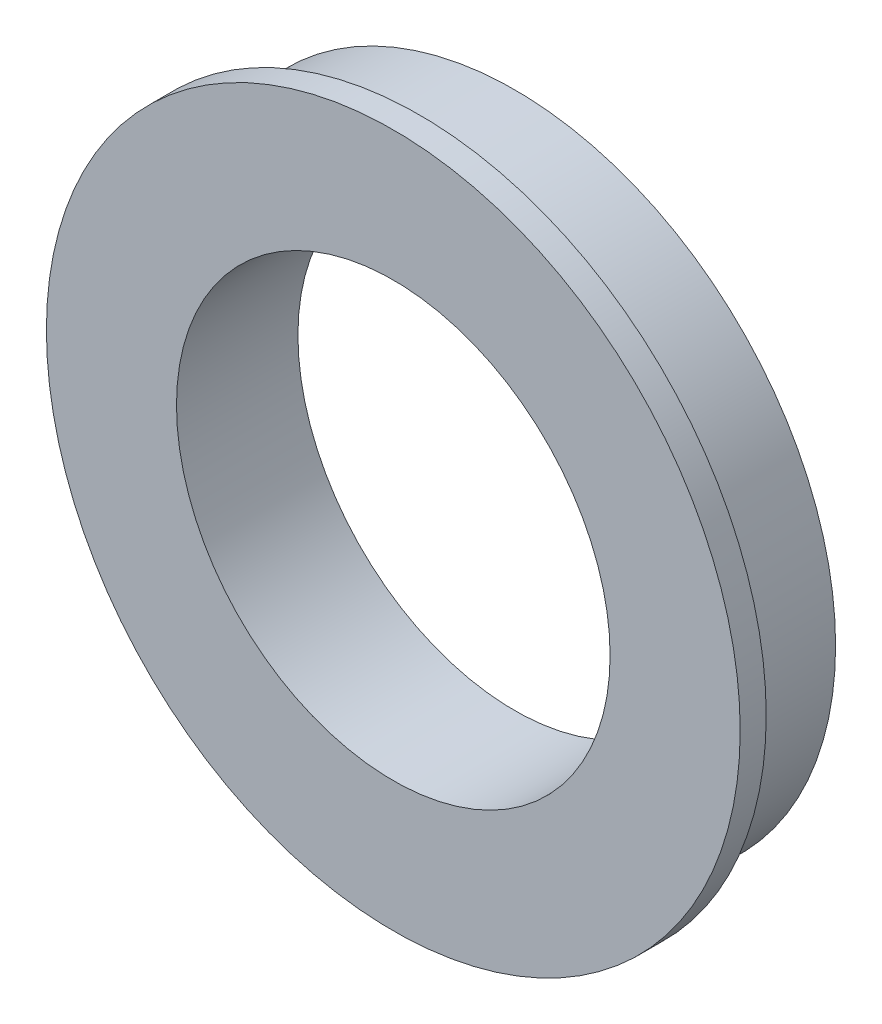
ISO-10303-21;
HEADER;
FILE_DESCRIPTION(('STEP AP214'),'2;1');
FILE_NAME('part.step','',(''),(''),'','','');
FILE_SCHEMA(('AUTOMOTIVE_DESIGN { 1 0 10303 214 1 1 1 1 }'));
ENDSEC;
DATA;
#1=APPLICATION_CONTEXT('core data for automotive mechanical design processes');
#2=APPLICATION_PROTOCOL_DEFINITION('international standard','automotive_design',2000,#1);
#3=PRODUCT_CONTEXT('',#1,'mechanical');
#4=PRODUCT('Part','Part','',(#3));
#5=PRODUCT_RELATED_PRODUCT_CATEGORY('part','',(#4));
#6=PRODUCT_DEFINITION_FORMATION('','',#4);
#7=PRODUCT_DEFINITION_CONTEXT('part definition',#1,'design');
#8=PRODUCT_DEFINITION('design','',#6,#7);
#9=PRODUCT_DEFINITION_SHAPE('','',#8);
#10=(LENGTH_UNIT() NAMED_UNIT(*) SI_UNIT(.MILLI.,.METRE.));
#11=(NAMED_UNIT(*) PLANE_ANGLE_UNIT() SI_UNIT($,.RADIAN.));
#12=(NAMED_UNIT(*) SI_UNIT($,.STERADIAN.) SOLID_ANGLE_UNIT());
#13=UNCERTAINTY_MEASURE_WITH_UNIT(LENGTH_MEASURE(1.E-05),#10,'distance_accuracy_value','');
#14=(GEOMETRIC_REPRESENTATION_CONTEXT(3) GLOBAL_UNCERTAINTY_ASSIGNED_CONTEXT((#13)) GLOBAL_UNIT_ASSIGNED_CONTEXT((#10,
#11,#12)) REPRESENTATION_CONTEXT('',''));
#15=CARTESIAN_POINT('',(0.,0.,0.));
#16=DIRECTION('',(0.,0.,1.));
#17=DIRECTION('',(1.,0.,0.));
#18=AXIS2_PLACEMENT_3D('',#15,#16,#17);
#19=CARTESIAN_POINT('',(0.,0.,7.));
#20=DIRECTION('',(0.,0.,-1.));
#21=DIRECTION('',(-1.,0.,0.));
#22=AXIS2_PLACEMENT_3D('',#19,#20,#21);
#23=CYLINDRICAL_SURFACE('',#22,18.5);
#24=CARTESIAN_POINT('',(0.,0.,0.));
#25=DIRECTION('',(0.,0.,1.));
#26=DIRECTION('',(1.,0.,0.));
#27=AXIS2_PLACEMENT_3D('',#24,#25,#26);
#28=CIRCLE('',#27,18.5);
#29=CARTESIAN_POINT('',(18.5,0.,0.));
#30=VERTEX_POINT('',#29);
#31=EDGE_CURVE('E42',#30,#30,#28,.T.);
#32=ORIENTED_EDGE('',*,*,#31,.T.);
#33=EDGE_LOOP('',(#32));
#34=FACE_BOUND('',#33,.T.);
#35=CARTESIAN_POINT('',(0.,0.,5.5));
#36=DIRECTION('',(0.,0.,1.));
#37=DIRECTION('',(1.,0.,0.));
#38=AXIS2_PLACEMENT_3D('',#35,#36,#37);
#39=CIRCLE('',#38,18.5);
#40=CARTESIAN_POINT('',(18.5,0.,5.5));
#41=VERTEX_POINT('',#40);
#42=EDGE_CURVE('E10',#41,#41,#39,.T.);
#43=ORIENTED_EDGE('',*,*,#42,.F.);
#44=EDGE_LOOP('',(#43));
#45=FACE_BOUND('',#44,.T.);
#46=ADVANCED_FACE('F39',(#34,#45),#23,.T.);
#47=CARTESIAN_POINT('',(0.,0.,7.));
#48=DIRECTION('',(0.,0.,1.));
#49=DIRECTION('',(1.,0.,0.));
#50=AXIS2_PLACEMENT_3D('',#47,#48,#49);
#51=PLANE('',#50);
#52=CARTESIAN_POINT('',(0.,0.,7.));
#53=DIRECTION('',(0.,0.,1.));
#54=DIRECTION('',(1.,0.,0.));
#55=AXIS2_PLACEMENT_3D('',#52,#53,#54);
#56=CIRCLE('',#55,12.5);
#57=CARTESIAN_POINT('',(12.5,0.,7.));
#58=VERTEX_POINT('',#57);
#59=EDGE_CURVE('E50',#58,#58,#56,.T.);
#60=ORIENTED_EDGE('',*,*,#59,.F.);
#61=EDGE_LOOP('',(#60));
#62=FACE_BOUND('',#61,.T.);
#63=CARTESIAN_POINT('',(0.,0.,7.));
#64=DIRECTION('',(0.,0.,1.));
#65=DIRECTION('',(1.,0.,0.));
#66=AXIS2_PLACEMENT_3D('',#63,#64,#65);
#67=CIRCLE('',#66,20.);
#68=CARTESIAN_POINT('',(20.,0.,7.));
#69=VERTEX_POINT('',#68);
#70=EDGE_CURVE('E53',#69,#69,#67,.T.);
#71=ORIENTED_EDGE('',*,*,#70,.T.);
#72=EDGE_LOOP('',(#71));
#73=FACE_BOUND('',#72,.T.);
#74=ADVANCED_FACE('F67',(#62,#73),#51,.T.);
#75=CARTESIAN_POINT('',(0.,0.,0.));
#76=DIRECTION('',(0.,0.,1.));
#77=DIRECTION('',(1.,0.,0.));
#78=AXIS2_PLACEMENT_3D('',#75,#76,#77);
#79=PLANE('',#78);
#80=ORIENTED_EDGE('',*,*,#31,.F.);
#81=EDGE_LOOP('',(#80));
#82=FACE_BOUND('',#81,.T.);
#83=CARTESIAN_POINT('',(0.,0.,0.));
#84=DIRECTION('',(0.,0.,1.));
#85=DIRECTION('',(1.,0.,0.));
#86=AXIS2_PLACEMENT_3D('',#83,#84,#85);
#87=CIRCLE('',#86,12.5);
#88=CARTESIAN_POINT('',(12.5,0.,0.));
#89=VERTEX_POINT('',#88);
#90=EDGE_CURVE('E56',#89,#89,#87,.T.);
#91=ORIENTED_EDGE('',*,*,#90,.T.);
#92=EDGE_LOOP('',(#91));
#93=FACE_BOUND('',#92,.T.);
#94=ADVANCED_FACE('F85',(#82,#93),#79,.F.);
#95=CARTESIAN_POINT('',(0.,0.,7.));
#96=DIRECTION('',(0.,0.,-1.));
#97=DIRECTION('',(-1.,0.,0.));
#98=AXIS2_PLACEMENT_3D('',#95,#96,#97);
#99=CYLINDRICAL_SURFACE('',#98,12.5);
#100=ORIENTED_EDGE('',*,*,#59,.T.);
#101=EDGE_LOOP('',(#100));
#102=FACE_BOUND('',#101,.T.);
#103=ORIENTED_EDGE('',*,*,#90,.F.);
#104=EDGE_LOOP('',(#103));
#105=FACE_BOUND('',#104,.T.);
#106=ADVANCED_FACE('F76',(#102,#105),#99,.F.);
#107=CARTESIAN_POINT('',(0.,0.,5.5));
#108=DIRECTION('',(0.,0.,1.));
#109=DIRECTION('',(1.,0.,0.));
#110=AXIS2_PLACEMENT_3D('',#107,#108,#109);
#111=PLANE('',#110);
#112=CARTESIAN_POINT('',(0.,0.,5.5));
#113=DIRECTION('',(0.,0.,1.));
#114=DIRECTION('',(1.,0.,0.));
#115=AXIS2_PLACEMENT_3D('',#112,#113,#114);
#116=CIRCLE('',#115,20.);
#117=CARTESIAN_POINT('',(20.,0.,5.5));
#118=VERTEX_POINT('',#117);
#119=EDGE_CURVE('E58',#118,#118,#116,.T.);
#120=ORIENTED_EDGE('',*,*,#119,.F.);
#121=EDGE_LOOP('',(#120));
#122=FACE_BOUND('',#121,.T.);
#123=ORIENTED_EDGE('',*,*,#42,.T.);
#124=EDGE_LOOP('',(#123));
#125=FACE_BOUND('',#124,.T.);
#126=ADVANCED_FACE('F71',(#122,#125),#111,.F.);
#127=CARTESIAN_POINT('',(0.,0.,5.5));
#128=DIRECTION('',(0.,0.,1.));
#129=DIRECTION('',(1.,0.,0.));
#130=AXIS2_PLACEMENT_3D('',#127,#128,#129);
#131=CYLINDRICAL_SURFACE('',#130,20.);
#132=ORIENTED_EDGE('',*,*,#119,.T.);
#133=EDGE_LOOP('',(#132));
#134=FACE_BOUND('',#133,.T.);
#135=ORIENTED_EDGE('',*,*,#70,.F.);
#136=EDGE_LOOP('',(#135));
#137=FACE_BOUND('',#136,.T.);
#138=ADVANCED_FACE('F69',(#134,#137),#131,.T.);
#139=CLOSED_SHELL('',(#46,#74,#94,#106,#126,#138));
#140=MANIFOLD_SOLID_BREP('B2',#139);
#141=ADVANCED_BREP_SHAPE_REPRESENTATION('',(#18,#140),#14);
#142=SHAPE_DEFINITION_REPRESENTATION(#9,#141);
ENDSEC;
END-ISO-10303-21;
